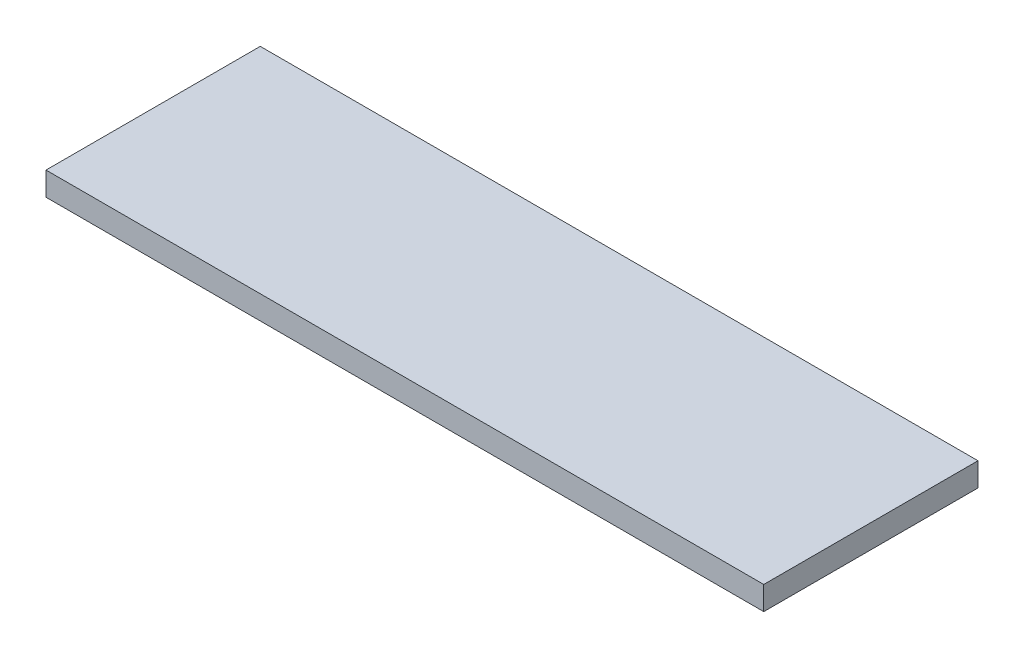
ISO-10303-21;
HEADER;
FILE_DESCRIPTION(('STEP AP214'),'2;1');
FILE_NAME('part.step','',(''),(''),'','','');
FILE_SCHEMA(('AUTOMOTIVE_DESIGN { 1 0 10303 214 1 1 1 1 }'));
ENDSEC;
DATA;
#1=APPLICATION_CONTEXT('core data for automotive mechanical design processes');
#2=APPLICATION_PROTOCOL_DEFINITION('international standard','automotive_design',2000,#1);
#3=PRODUCT_CONTEXT('',#1,'mechanical');
#4=PRODUCT('Part','Part','',(#3));
#5=PRODUCT_RELATED_PRODUCT_CATEGORY('part','',(#4));
#6=PRODUCT_DEFINITION_FORMATION('','',#4);
#7=PRODUCT_DEFINITION_CONTEXT('part definition',#1,'design');
#8=PRODUCT_DEFINITION('design','',#6,#7);
#9=PRODUCT_DEFINITION_SHAPE('','',#8);
#10=(LENGTH_UNIT() NAMED_UNIT(*) SI_UNIT(.MILLI.,.METRE.));
#11=(NAMED_UNIT(*) PLANE_ANGLE_UNIT() SI_UNIT($,.RADIAN.));
#12=(NAMED_UNIT(*) SI_UNIT($,.STERADIAN.) SOLID_ANGLE_UNIT());
#13=UNCERTAINTY_MEASURE_WITH_UNIT(LENGTH_MEASURE(1.E-05),#10,'distance_accuracy_value','');
#14=(GEOMETRIC_REPRESENTATION_CONTEXT(3) GLOBAL_UNCERTAINTY_ASSIGNED_CONTEXT((#13)) GLOBAL_UNIT_ASSIGNED_CONTEXT((#10,
#11,#12)) REPRESENTATION_CONTEXT('',''));
#15=CARTESIAN_POINT('',(0.,0.,0.));
#16=DIRECTION('',(0.,0.,1.));
#17=DIRECTION('',(1.,0.,0.));
#18=AXIS2_PLACEMENT_3D('',#15,#16,#17);
#19=CARTESIAN_POINT('',(-281.927710843374,22.,69.2771084337349));
#20=DIRECTION('',(1.,0.,0.));
#21=DIRECTION('',(0.,0.,-1.));
#22=AXIS2_PLACEMENT_3D('',#19,#20,#21);
#23=PLANE('',#22);
#24=DIRECTION('',(0.,0.,1.));
#25=VECTOR('',#24,1.);
#26=CARTESIAN_POINT('',(-281.927710843374,0.,69.2771084337349));
#27=LINE('',#26,#25);
#28=CARTESIAN_POINT('',(-281.927710843374,0.,-130.722891566265));
#29=VERTEX_POINT('',#28);
#30=CARTESIAN_POINT('',(-281.927710843374,0.,69.2771084337349));
#31=VERTEX_POINT('',#30);
#32=EDGE_CURVE('E107',#29,#31,#27,.T.);
#33=ORIENTED_EDGE('',*,*,#32,.T.);
#34=DIRECTION('',(0.,-1.,0.));
#35=VECTOR('',#34,1.);
#36=CARTESIAN_POINT('',(-281.927710843374,22.,69.2771084337349));
#37=LINE('',#36,#35);
#38=CARTESIAN_POINT('',(-281.927710843374,22.,69.2771084337349));
#39=VERTEX_POINT('',#38);
#40=EDGE_CURVE('E11',#39,#31,#37,.T.);
#41=ORIENTED_EDGE('',*,*,#40,.F.);
#42=DIRECTION('',(0.,0.,1.));
#43=VECTOR('',#42,1.);
#44=CARTESIAN_POINT('',(-281.927710843374,22.,69.2771084337349));
#45=LINE('',#44,#43);
#46=CARTESIAN_POINT('',(-281.927710843374,22.,-130.722891566265));
#47=VERTEX_POINT('',#46);
#48=EDGE_CURVE('E90',#47,#39,#45,.T.);
#49=ORIENTED_EDGE('',*,*,#48,.F.);
#50=DIRECTION('',(0.,-1.,0.));
#51=VECTOR('',#50,1.);
#52=CARTESIAN_POINT('',(-281.927710843374,22.,-130.722891566265));
#53=LINE('',#52,#51);
#54=EDGE_CURVE('E103',#47,#29,#53,.T.);
#55=ORIENTED_EDGE('',*,*,#54,.T.);
#56=EDGE_LOOP('',(#33,#41,#49,#55));
#57=FACE_BOUND('',#56,.T.);
#58=ADVANCED_FACE('F38',(#57),#23,.F.);
#59=CARTESIAN_POINT('',(-281.927710843374,22.,69.2771084337349));
#60=DIRECTION('',(0.,0.,-1.));
#61=DIRECTION('',(-1.,0.,0.));
#62=AXIS2_PLACEMENT_3D('',#59,#60,#61);
#63=PLANE('',#62);
#64=DIRECTION('',(1.,0.,0.));
#65=VECTOR('',#64,1.);
#66=CARTESIAN_POINT('',(-281.927710843374,0.,69.2771084337349));
#67=LINE('',#66,#65);
#68=CARTESIAN_POINT('',(388.072289156626,0.,69.2771084337349));
#69=VERTEX_POINT('',#68);
#70=EDGE_CURVE('E95',#31,#69,#67,.T.);
#71=ORIENTED_EDGE('',*,*,#70,.T.);
#72=DIRECTION('',(0.,-1.,0.));
#73=VECTOR('',#72,1.);
#74=CARTESIAN_POINT('',(388.072289156626,22.,69.2771084337349));
#75=LINE('',#74,#73);
#76=CARTESIAN_POINT('',(388.072289156626,22.,69.2771084337349));
#77=VERTEX_POINT('',#76);
#78=EDGE_CURVE('E47',#77,#69,#75,.T.);
#79=ORIENTED_EDGE('',*,*,#78,.F.);
#80=DIRECTION('',(1.,0.,0.));
#81=VECTOR('',#80,1.);
#82=CARTESIAN_POINT('',(-281.927710843374,22.,69.2771084337349));
#83=LINE('',#82,#81);
#84=EDGE_CURVE('E85',#39,#77,#83,.T.);
#85=ORIENTED_EDGE('',*,*,#84,.F.);
#86=ORIENTED_EDGE('',*,*,#40,.T.);
#87=EDGE_LOOP('',(#71,#79,#85,#86));
#88=FACE_BOUND('',#87,.T.);
#89=ADVANCED_FACE('F94',(#88),#63,.F.);
#90=CARTESIAN_POINT('',(388.072289156626,22.,69.2771084337349));
#91=DIRECTION('',(-1.,0.,0.));
#92=DIRECTION('',(0.,0.,1.));
#93=AXIS2_PLACEMENT_3D('',#90,#91,#92);
#94=PLANE('',#93);
#95=DIRECTION('',(0.,0.,-1.));
#96=VECTOR('',#95,1.);
#97=CARTESIAN_POINT('',(388.072289156626,0.,69.2771084337349));
#98=LINE('',#97,#96);
#99=CARTESIAN_POINT('',(388.072289156626,0.,-130.722891566265));
#100=VERTEX_POINT('',#99);
#101=EDGE_CURVE('E72',#69,#100,#98,.T.);
#102=ORIENTED_EDGE('',*,*,#101,.T.);
#103=DIRECTION('',(0.,-1.,0.));
#104=VECTOR('',#103,1.);
#105=CARTESIAN_POINT('',(388.072289156626,22.,-130.722891566265));
#106=LINE('',#105,#104);
#107=CARTESIAN_POINT('',(388.072289156626,22.,-130.722891566265));
#108=VERTEX_POINT('',#107);
#109=EDGE_CURVE('E97',#108,#100,#106,.T.);
#110=ORIENTED_EDGE('',*,*,#109,.F.);
#111=DIRECTION('',(0.,0.,-1.));
#112=VECTOR('',#111,1.);
#113=CARTESIAN_POINT('',(388.072289156626,22.,69.2771084337349));
#114=LINE('',#113,#112);
#115=EDGE_CURVE('E88',#77,#108,#114,.T.);
#116=ORIENTED_EDGE('',*,*,#115,.F.);
#117=ORIENTED_EDGE('',*,*,#78,.T.);
#118=EDGE_LOOP('',(#102,#110,#116,#117));
#119=FACE_BOUND('',#118,.T.);
#120=ADVANCED_FACE('F98',(#119),#94,.F.);
#121=CARTESIAN_POINT('',(-281.927710843374,22.,-130.722891566265));
#122=DIRECTION('',(0.,0.,1.));
#123=DIRECTION('',(1.,0.,0.));
#124=AXIS2_PLACEMENT_3D('',#121,#122,#123);
#125=PLANE('',#124);
#126=DIRECTION('',(-1.,0.,0.));
#127=VECTOR('',#126,1.);
#128=CARTESIAN_POINT('',(-281.927710843374,0.,-130.722891566265));
#129=LINE('',#128,#127);
#130=EDGE_CURVE('E78',#100,#29,#129,.T.);
#131=ORIENTED_EDGE('',*,*,#130,.T.);
#132=ORIENTED_EDGE('',*,*,#54,.F.);
#133=DIRECTION('',(-1.,0.,0.));
#134=VECTOR('',#133,1.);
#135=CARTESIAN_POINT('',(-281.927710843374,22.,-130.722891566265));
#136=LINE('',#135,#134);
#137=EDGE_CURVE('E55',#108,#47,#136,.T.);
#138=ORIENTED_EDGE('',*,*,#137,.F.);
#139=ORIENTED_EDGE('',*,*,#109,.T.);
#140=EDGE_LOOP('',(#131,#132,#138,#139));
#141=FACE_BOUND('',#140,.T.);
#142=ADVANCED_FACE('F121',(#141),#125,.F.);
#143=CARTESIAN_POINT('',(0.,22.,0.));
#144=DIRECTION('',(0.,-1.,0.));
#145=DIRECTION('',(0.,0.,-1.));
#146=AXIS2_PLACEMENT_3D('',#143,#144,#145);
#147=PLANE('',#146);
#148=ORIENTED_EDGE('',*,*,#48,.T.);
#149=ORIENTED_EDGE('',*,*,#84,.T.);
#150=ORIENTED_EDGE('',*,*,#115,.T.);
#151=ORIENTED_EDGE('',*,*,#137,.T.);
#152=EDGE_LOOP('',(#148,#149,#150,#151));
#153=FACE_BOUND('',#152,.T.);
#154=ADVANCED_FACE('F86',(#153),#147,.F.);
#155=CARTESIAN_POINT('',(0.,0.,0.));
#156=DIRECTION('',(0.,-1.,0.));
#157=DIRECTION('',(0.,0.,-1.));
#158=AXIS2_PLACEMENT_3D('',#155,#156,#157);
#159=PLANE('',#158);
#160=ORIENTED_EDGE('',*,*,#32,.F.);
#161=ORIENTED_EDGE('',*,*,#130,.F.);
#162=ORIENTED_EDGE('',*,*,#101,.F.);
#163=ORIENTED_EDGE('',*,*,#70,.F.);
#164=EDGE_LOOP('',(#160,#161,#162,#163));
#165=FACE_BOUND('',#164,.T.);
#166=ADVANCED_FACE('F124',(#165),#159,.T.);
#167=CLOSED_SHELL('',(#58,#89,#120,#142,#154,#166));
#168=MANIFOLD_SOLID_BREP('B2',#167);
#169=ADVANCED_BREP_SHAPE_REPRESENTATION('',(#18,#168),#14);
#170=SHAPE_DEFINITION_REPRESENTATION(#9,#169);
ENDSEC;
END-ISO-10303-21;
